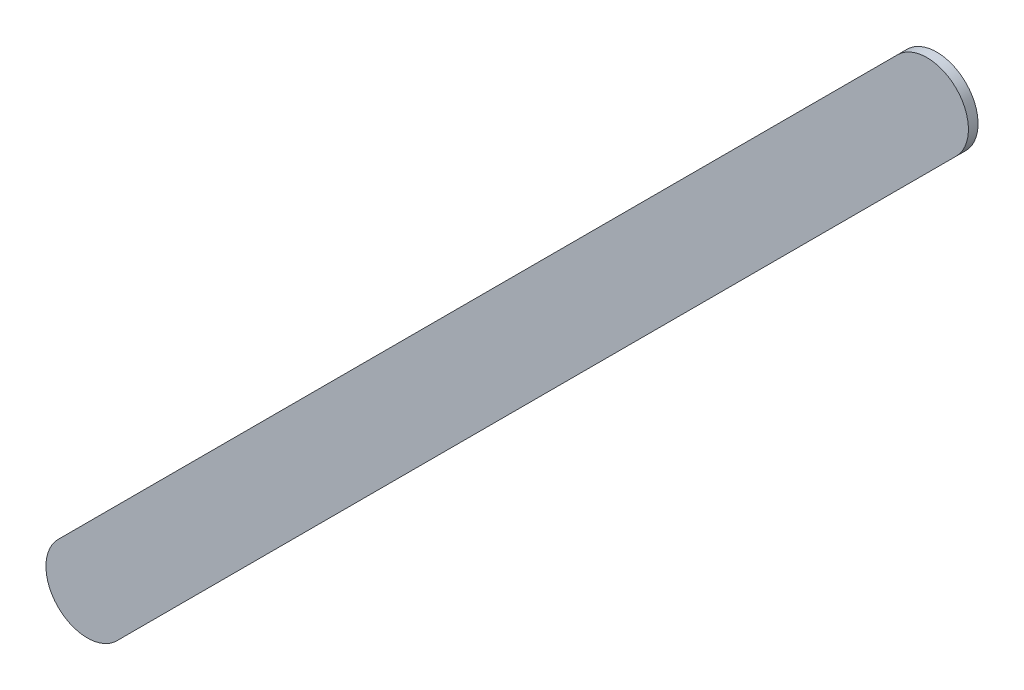
ISO-10303-21;
HEADER;
FILE_DESCRIPTION(('STEP AP214'),'2;1');
FILE_NAME('part.step','',(''),(''),'','','');
FILE_SCHEMA(('AUTOMOTIVE_DESIGN { 1 0 10303 214 1 1 1 1 }'));
ENDSEC;
DATA;
#1=APPLICATION_CONTEXT('core data for automotive mechanical design processes');
#2=APPLICATION_PROTOCOL_DEFINITION('international standard','automotive_design',2000,#1);
#3=PRODUCT_CONTEXT('',#1,'mechanical');
#4=PRODUCT('Part','Part','',(#3));
#5=PRODUCT_RELATED_PRODUCT_CATEGORY('part','',(#4));
#6=PRODUCT_DEFINITION_FORMATION('','',#4);
#7=PRODUCT_DEFINITION_CONTEXT('part definition',#1,'design');
#8=PRODUCT_DEFINITION('design','',#6,#7);
#9=PRODUCT_DEFINITION_SHAPE('','',#8);
#10=(LENGTH_UNIT() NAMED_UNIT(*) SI_UNIT(.MILLI.,.METRE.));
#11=(NAMED_UNIT(*) PLANE_ANGLE_UNIT() SI_UNIT($,.RADIAN.));
#12=(NAMED_UNIT(*) SI_UNIT($,.STERADIAN.) SOLID_ANGLE_UNIT());
#13=UNCERTAINTY_MEASURE_WITH_UNIT(LENGTH_MEASURE(1.E-05),#10,'distance_accuracy_value','');
#14=(GEOMETRIC_REPRESENTATION_CONTEXT(3) GLOBAL_UNCERTAINTY_ASSIGNED_CONTEXT((#13)) GLOBAL_UNIT_ASSIGNED_CONTEXT((#10,
#11,#12)) REPRESENTATION_CONTEXT('',''));
#15=CARTESIAN_POINT('',(0.,0.,0.));
#16=DIRECTION('',(0.,0.,1.));
#17=DIRECTION('',(1.,0.,0.));
#18=AXIS2_PLACEMENT_3D('',#15,#16,#17);
#19=CARTESIAN_POINT('',(126.403933,-75.483933,1.635));
#20=DIRECTION('',(0.,0.,1.));
#21=DIRECTION('',(1.,0.,0.));
#22=AXIS2_PLACEMENT_3D('',#19,#20,#21);
#23=PLANE('',#22);
#24=DIRECTION('',(-0.707106781186548,-0.707106781186548,0.));
#25=VECTOR('',#24,1.);
#26=CARTESIAN_POINT('',(126.403933,-75.483933,1.635));
#27=LINE('',#26,#25);
#28=CARTESIAN_POINT('',(126.403933,-75.483933,1.635));
#29=VERTEX_POINT('',#28);
#30=CARTESIAN_POINT('',(123.363933,-78.523933,1.635));
#31=VERTEX_POINT('',#30);
#32=EDGE_CURVE('E83',#29,#31,#27,.T.);
#33=ORIENTED_EDGE('',*,*,#32,.T.);
#34=CARTESIAN_POINT('',(123.4699995,-78.6299995,1.635));
#35=DIRECTION('',(0.,0.,1.));
#36=DIRECTION('',(-0.707106781186548,0.707106781186548,0.));
#37=AXIS2_PLACEMENT_3D('',#34,#35,#36);
#38=CIRCLE('',#37,0.150000682813);
#39=CARTESIAN_POINT('',(123.576066,-78.736066,1.635));
#40=VERTEX_POINT('',#39);
#41=EDGE_CURVE('E98',#31,#40,#38,.T.);
#42=ORIENTED_EDGE('',*,*,#41,.T.);
#43=DIRECTION('',(0.707106781186548,0.707106781186548,0.));
#44=VECTOR('',#43,1.);
#45=CARTESIAN_POINT('',(123.576066,-78.736066,1.635));
#46=LINE('',#45,#44);
#47=CARTESIAN_POINT('',(126.616066,-75.696066,1.635));
#48=VERTEX_POINT('',#47);
#49=EDGE_CURVE('E75',#40,#48,#46,.T.);
#50=ORIENTED_EDGE('',*,*,#49,.T.);
#51=CARTESIAN_POINT('',(126.5099995,-75.5899995,1.635));
#52=DIRECTION('',(0.,0.,1.));
#53=DIRECTION('',(0.707106781186548,-0.707106781186548,0.));
#54=AXIS2_PLACEMENT_3D('',#51,#52,#53);
#55=CIRCLE('',#54,0.150000682813);
#56=EDGE_CURVE('E11',#48,#29,#55,.T.);
#57=ORIENTED_EDGE('',*,*,#56,.T.);
#58=EDGE_LOOP('',(#33,#42,#50,#57));
#59=FACE_BOUND('',#58,.T.);
#60=ADVANCED_FACE('F17',(#59),#23,.T.);
#61=CARTESIAN_POINT('',(126.403933,-75.483933,1.6));
#62=DIRECTION('',(0.,0.,1.));
#63=DIRECTION('',(1.,0.,0.));
#64=AXIS2_PLACEMENT_3D('',#61,#62,#63);
#65=PLANE('',#64);
#66=CARTESIAN_POINT('',(126.5099995,-75.5899995,1.6));
#67=DIRECTION('',(0.,0.,1.));
#68=DIRECTION('',(0.707106781186548,-0.707106781186548,0.));
#69=AXIS2_PLACEMENT_3D('',#66,#67,#68);
#70=CIRCLE('',#69,0.150000682813);
#71=CARTESIAN_POINT('',(126.616066,-75.696066,1.6));
#72=VERTEX_POINT('',#71);
#73=CARTESIAN_POINT('',(126.403933,-75.483933,1.6));
#74=VERTEX_POINT('',#73);
#75=EDGE_CURVE('E26',#72,#74,#70,.T.);
#76=ORIENTED_EDGE('',*,*,#75,.F.);
#77=DIRECTION('',(0.707106781186548,0.707106781186548,0.));
#78=VECTOR('',#77,1.);
#79=CARTESIAN_POINT('',(123.576066,-78.736066,1.6));
#80=LINE('',#79,#78);
#81=CARTESIAN_POINT('',(123.576066,-78.736066,1.6));
#82=VERTEX_POINT('',#81);
#83=EDGE_CURVE('E101',#82,#72,#80,.T.);
#84=ORIENTED_EDGE('',*,*,#83,.F.);
#85=CARTESIAN_POINT('',(123.4699995,-78.6299995,1.6));
#86=DIRECTION('',(0.,0.,1.));
#87=DIRECTION('',(-0.707106781186548,0.707106781186548,0.));
#88=AXIS2_PLACEMENT_3D('',#85,#86,#87);
#89=CIRCLE('',#88,0.150000682813);
#90=CARTESIAN_POINT('',(123.363933,-78.523933,1.6));
#91=VERTEX_POINT('',#90);
#92=EDGE_CURVE('E85',#91,#82,#89,.T.);
#93=ORIENTED_EDGE('',*,*,#92,.F.);
#94=DIRECTION('',(-0.707106781186548,-0.707106781186548,0.));
#95=VECTOR('',#94,1.);
#96=CARTESIAN_POINT('',(126.403933,-75.483933,1.6));
#97=LINE('',#96,#95);
#98=EDGE_CURVE('E81',#74,#91,#97,.T.);
#99=ORIENTED_EDGE('',*,*,#98,.F.);
#100=EDGE_LOOP('',(#76,#84,#93,#99));
#101=FACE_BOUND('',#100,.T.);
#102=ADVANCED_FACE('F19',(#101),#65,.F.);
#103=CARTESIAN_POINT('',(126.5099995,-75.5899995,1.6));
#104=DIRECTION('',(0.,0.,-1.));
#105=DIRECTION('',(0.707106781186548,-0.707106781186548,0.));
#106=AXIS2_PLACEMENT_3D('',#103,#104,#105);
#107=CYLINDRICAL_SURFACE('',#106,0.150000682813);
#108=ORIENTED_EDGE('',*,*,#75,.T.);
#109=DIRECTION('',(0.,0.,1.));
#110=VECTOR('',#109,1.);
#111=CARTESIAN_POINT('',(126.403933,-75.483933,1.6));
#112=LINE('',#111,#110);
#113=EDGE_CURVE('E69',#74,#29,#112,.T.);
#114=ORIENTED_EDGE('',*,*,#113,.T.);
#115=ORIENTED_EDGE('',*,*,#56,.F.);
#116=DIRECTION('',(0.,0.,1.));
#117=VECTOR('',#116,1.);
#118=CARTESIAN_POINT('',(126.616066,-75.696066,1.6));
#119=LINE('',#118,#117);
#120=EDGE_CURVE('E72',#72,#48,#119,.T.);
#121=ORIENTED_EDGE('',*,*,#120,.F.);
#122=EDGE_LOOP('',(#108,#114,#115,#121));
#123=FACE_BOUND('',#122,.T.);
#124=ADVANCED_FACE('F68',(#123),#107,.T.);
#125=CARTESIAN_POINT('',(123.576066,-78.736066,1.6));
#126=DIRECTION('',(-0.707106781186548,0.707106781186548,0.));
#127=DIRECTION('',(0.,0.,1.));
#128=AXIS2_PLACEMENT_3D('',#125,#126,#127);
#129=PLANE('',#128);
#130=ORIENTED_EDGE('',*,*,#83,.T.);
#131=ORIENTED_EDGE('',*,*,#120,.T.);
#132=ORIENTED_EDGE('',*,*,#49,.F.);
#133=DIRECTION('',(0.,0.,1.));
#134=VECTOR('',#133,1.);
#135=CARTESIAN_POINT('',(123.576066,-78.736066,1.6));
#136=LINE('',#135,#134);
#137=EDGE_CURVE('E102',#82,#40,#136,.T.);
#138=ORIENTED_EDGE('',*,*,#137,.F.);
#139=EDGE_LOOP('',(#130,#131,#132,#138));
#140=FACE_BOUND('',#139,.T.);
#141=ADVANCED_FACE('F120',(#140),#129,.F.);
#142=CARTESIAN_POINT('',(123.4699995,-78.6299995,1.6));
#143=DIRECTION('',(0.,0.,-1.));
#144=DIRECTION('',(-0.707106781186548,0.707106781186548,0.));
#145=AXIS2_PLACEMENT_3D('',#142,#143,#144);
#146=CYLINDRICAL_SURFACE('',#145,0.150000682813);
#147=ORIENTED_EDGE('',*,*,#92,.T.);
#148=ORIENTED_EDGE('',*,*,#137,.T.);
#149=ORIENTED_EDGE('',*,*,#41,.F.);
#150=DIRECTION('',(0.,0.,1.));
#151=VECTOR('',#150,1.);
#152=CARTESIAN_POINT('',(123.363933,-78.523933,1.6));
#153=LINE('',#152,#151);
#154=EDGE_CURVE('E90',#91,#31,#153,.T.);
#155=ORIENTED_EDGE('',*,*,#154,.F.);
#156=EDGE_LOOP('',(#147,#148,#149,#155));
#157=FACE_BOUND('',#156,.T.);
#158=ADVANCED_FACE('F122',(#157),#146,.T.);
#159=CARTESIAN_POINT('',(126.403933,-75.483933,1.6));
#160=DIRECTION('',(0.707106781186548,-0.707106781186548,0.));
#161=DIRECTION('',(0.,0.,-1.));
#162=AXIS2_PLACEMENT_3D('',#159,#160,#161);
#163=PLANE('',#162);
#164=ORIENTED_EDGE('',*,*,#98,.T.);
#165=ORIENTED_EDGE('',*,*,#154,.T.);
#166=ORIENTED_EDGE('',*,*,#32,.F.);
#167=ORIENTED_EDGE('',*,*,#113,.F.);
#168=EDGE_LOOP('',(#164,#165,#166,#167));
#169=FACE_BOUND('',#168,.T.);
#170=ADVANCED_FACE('F79',(#169),#163,.F.);
#171=CLOSED_SHELL('',(#60,#102,#124,#141,#158,#170));
#172=MANIFOLD_SOLID_BREP('B1',#171);
#173=ADVANCED_BREP_SHAPE_REPRESENTATION('',(#18,#172),#14);
#174=SHAPE_DEFINITION_REPRESENTATION(#9,#173);
ENDSEC;
END-ISO-10303-21;
